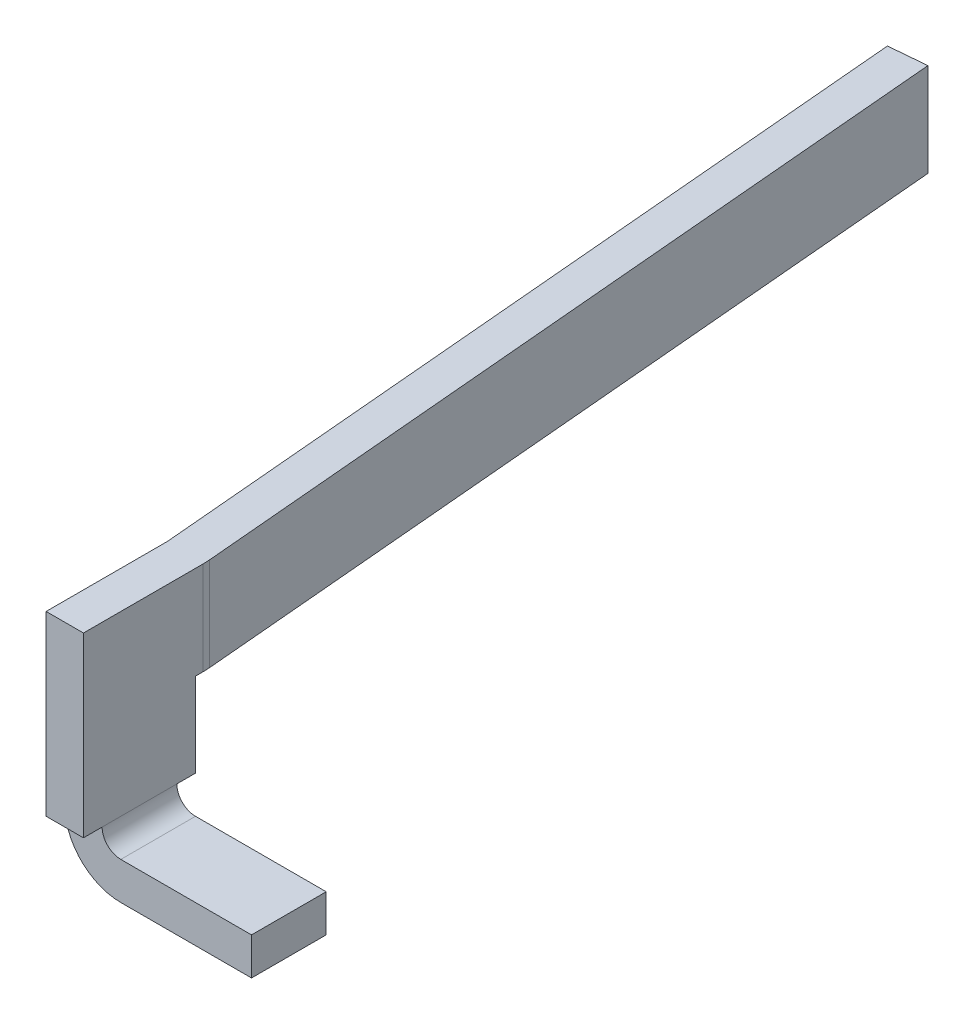
ISO-10303-21;
HEADER;
FILE_DESCRIPTION(('STEP AP214'),'2;1');
FILE_NAME('part.step','',(''),(''),'','','');
FILE_SCHEMA(('AUTOMOTIVE_DESIGN { 1 0 10303 214 1 1 1 1 }'));
ENDSEC;
DATA;
#1=APPLICATION_CONTEXT('core data for automotive mechanical design processes');
#2=APPLICATION_PROTOCOL_DEFINITION('international standard','automotive_design',2000,#1);
#3=PRODUCT_CONTEXT('',#1,'mechanical');
#4=PRODUCT('Part','Part','',(#3));
#5=PRODUCT_RELATED_PRODUCT_CATEGORY('part','',(#4));
#6=PRODUCT_DEFINITION_FORMATION('','',#4);
#7=PRODUCT_DEFINITION_CONTEXT('part definition',#1,'design');
#8=PRODUCT_DEFINITION('design','',#6,#7);
#9=PRODUCT_DEFINITION_SHAPE('','',#8);
#10=(LENGTH_UNIT() NAMED_UNIT(*) SI_UNIT(.MILLI.,.METRE.));
#11=(NAMED_UNIT(*) PLANE_ANGLE_UNIT() SI_UNIT($,.RADIAN.));
#12=(NAMED_UNIT(*) SI_UNIT($,.STERADIAN.) SOLID_ANGLE_UNIT());
#13=UNCERTAINTY_MEASURE_WITH_UNIT(LENGTH_MEASURE(1.E-05),#10,'distance_accuracy_value','');
#14=(GEOMETRIC_REPRESENTATION_CONTEXT(3) GLOBAL_UNCERTAINTY_ASSIGNED_CONTEXT((#13)) GLOBAL_UNIT_ASSIGNED_CONTEXT((#10,
#11,#12)) REPRESENTATION_CONTEXT('',''));
#15=CARTESIAN_POINT('',(0.,0.,0.));
#16=DIRECTION('',(0.,0.,1.));
#17=DIRECTION('',(1.,0.,0.));
#18=AXIS2_PLACEMENT_3D('',#15,#16,#17);
#19=CARTESIAN_POINT('',(5.19934943666418,0.740000000000001,-0.666168161877658));
#20=DIRECTION('',(0.996194698091746,0.,-0.0871557427476471));
#21=DIRECTION('',(-0.0871557427476471,0.,-0.996194698091746));
#22=AXIS2_PLACEMENT_3D('',#19,#20,#21);
#23=PLANE('',#22);
#24=DIRECTION('',(0.,-1.,0.));
#25=VECTOR('',#24,1.);
#26=CARTESIAN_POINT('',(4.8295880933225,1.,-4.89255965581284));
#27=LINE('',#26,#25);
#28=CARTESIAN_POINT('',(4.8295880933225,1.25,-4.89255965581284));
#29=VERTEX_POINT('',#28);
#30=CARTESIAN_POINT('',(4.82958809332251,0.750000000000001,-4.89255965581285));
#31=VERTEX_POINT('',#30);
#32=EDGE_CURVE('E136',#29,#31,#27,.T.);
#33=ORIENTED_EDGE('',*,*,#32,.F.);
#34=DIRECTION('',(-0.0871557427476445,0.,-0.996194698091747));
#35=VECTOR('',#34,1.);
#36=CARTESIAN_POINT('',(5.0140329862796,1.25,-2.78434488233571));
#37=LINE('',#36,#35);
#38=CARTESIAN_POINT('',(5.1984778792367,1.25,-0.676130108858565));
#39=VERTEX_POINT('',#38);
#40=EDGE_CURVE('E133',#39,#29,#37,.T.);
#41=ORIENTED_EDGE('',*,*,#40,.F.);
#42=DIRECTION('',(0.,-1.,0.));
#43=VECTOR('',#42,1.);
#44=CARTESIAN_POINT('',(5.1984778792367,1.,-0.676130108858577));
#45=LINE('',#44,#43);
#46=CARTESIAN_POINT('',(5.1984778792367,0.750000000000002,-0.676130108858565));
#47=VERTEX_POINT('',#46);
#48=EDGE_CURVE('E184',#39,#47,#45,.T.);
#49=ORIENTED_EDGE('',*,*,#48,.T.);
#50=DIRECTION('',(0.0871557427476445,0.,0.996194698091747));
#51=VECTOR('',#50,1.);
#52=CARTESIAN_POINT('',(5.0140329862796,0.750000000000002,-2.78434488233571));
#53=LINE('',#52,#51);
#54=EDGE_CURVE('E151',#31,#47,#53,.T.);
#55=ORIENTED_EDGE('',*,*,#54,.F.);
#56=EDGE_LOOP('',(#33,#41,#49,#55));
#57=FACE_BOUND('',#56,.T.);
#58=ADVANCED_FACE('F17',(#57),#23,.T.);
#59=CARTESIAN_POINT('',(4.62038720672324,0.740000000000001,-4.87425694983583));
#60=DIRECTION('',(-0.087155742747688,0.,-0.996194698091743));
#61=DIRECTION('',(0.,1.,0.));
#62=AXIS2_PLACEMENT_3D('',#59,#60,#61);
#63=PLANE('',#62);
#64=ORIENTED_EDGE('',*,*,#32,.T.);
#65=DIRECTION('',(0.996194698091743,0.,-0.0871557427476917));
#66=VECTOR('',#65,1.);
#67=CARTESIAN_POINT('',(4.72996862351333,0.750000000000001,-4.88384408153808));
#68=LINE('',#67,#66);
#69=CARTESIAN_POINT('',(4.63034915370416,0.750000000000001,-4.87512850726331));
#70=VERTEX_POINT('',#69);
#71=EDGE_CURVE('E142',#70,#31,#68,.T.);
#72=ORIENTED_EDGE('',*,*,#71,.F.);
#73=DIRECTION('',(0.,-1.,0.));
#74=VECTOR('',#73,1.);
#75=CARTESIAN_POINT('',(4.63034915370416,1.,-4.87512850726331));
#76=LINE('',#75,#74);
#77=CARTESIAN_POINT('',(4.63034915370416,1.25,-4.87512850726331));
#78=VERTEX_POINT('',#77);
#79=EDGE_CURVE('E139',#78,#70,#76,.T.);
#80=ORIENTED_EDGE('',*,*,#79,.F.);
#81=DIRECTION('',(0.996194698091743,0.,-0.087155742747688));
#82=VECTOR('',#81,1.);
#83=CARTESIAN_POINT('',(4.72996862351333,1.25,-4.88384408153807));
#84=LINE('',#83,#82);
#85=EDGE_CURVE('E125',#78,#29,#84,.T.);
#86=ORIENTED_EDGE('',*,*,#85,.T.);
#87=EDGE_LOOP('',(#64,#72,#80,#86));
#88=FACE_BOUND('',#87,.T.);
#89=ADVANCED_FACE('F140',(#88),#63,.T.);
#90=CARTESIAN_POINT('',(4.80000000000025,1.25,-0.641267811759518));
#91=DIRECTION('',(0.,-1.,0.));
#92=DIRECTION('',(0.,0.,-1.));
#93=AXIS2_PLACEMENT_3D('',#90,#91,#92);
#94=CYLINDRICAL_SURFACE('',#93,0.39999999999975);
#95=DIRECTION('',(0.,1.,0.));
#96=VECTOR('',#95,1.);
#97=CARTESIAN_POINT('',(5.2,0.775,-0.641267811759518));
#98=LINE('',#97,#96);
#99=CARTESIAN_POINT('',(5.2,0.750000000000002,-0.641267811759518));
#100=VERTEX_POINT('',#99);
#101=CARTESIAN_POINT('',(5.2,1.25,-0.641267811759518));
#102=VERTEX_POINT('',#101);
#103=EDGE_CURVE('E208',#100,#102,#98,.T.);
#104=ORIENTED_EDGE('',*,*,#103,.F.);
#105=CARTESIAN_POINT('',(4.80000000000025,0.750000000000002,-0.641267811759518));
#106=DIRECTION('',(0.,-1.,0.));
#107=DIRECTION('',(0.,0.,-1.));
#108=AXIS2_PLACEMENT_3D('',#105,#106,#107);
#109=CIRCLE('',#108,0.39999999999975);
#110=EDGE_CURVE('E206',#47,#100,#109,.T.);
#111=ORIENTED_EDGE('',*,*,#110,.F.);
#112=ORIENTED_EDGE('',*,*,#48,.F.);
#113=CARTESIAN_POINT('',(4.80000000000025,1.25,-0.641267811759518));
#114=DIRECTION('',(0.,1.,0.));
#115=DIRECTION('',(0.,0.,1.));
#116=AXIS2_PLACEMENT_3D('',#113,#114,#115);
#117=CIRCLE('',#116,0.39999999999975);
#118=EDGE_CURVE('E21',#102,#39,#117,.T.);
#119=ORIENTED_EDGE('',*,*,#118,.F.);
#120=EDGE_LOOP('',(#104,#111,#112,#119));
#121=FACE_BOUND('',#120,.T.);
#122=ADVANCED_FACE('F415',(#121),#94,.T.);
#123=CARTESIAN_POINT('',(4.62947759627668,0.740000000000001,-4.88509045424423));
#124=DIRECTION('',(-0.996194698091746,0.,0.087155742747647));
#125=DIRECTION('',(0.087155742747647,0.,0.996194698091746));
#126=AXIS2_PLACEMENT_3D('',#123,#124,#125);
#127=PLANE('',#126);
#128=ORIENTED_EDGE('',*,*,#79,.T.);
#129=DIRECTION('',(0.0871557427476468,0.,0.996194698091747));
#130=VECTOR('',#129,1.);
#131=CARTESIAN_POINT('',(4.81479404666126,0.750000000000001,-2.76691373378618));
#132=LINE('',#131,#130);
#133=CARTESIAN_POINT('',(4.99923893961835,0.750000000000002,-0.658698960309061));
#134=VERTEX_POINT('',#133);
#135=EDGE_CURVE('E145',#70,#134,#132,.T.);
#136=ORIENTED_EDGE('',*,*,#135,.T.);
#137=DIRECTION('',(0.,-1.,0.));
#138=VECTOR('',#137,1.);
#139=CARTESIAN_POINT('',(4.99923893961835,1.,-0.658698960309047));
#140=LINE('',#139,#138);
#141=CARTESIAN_POINT('',(4.99923893961835,1.25,-0.658698960309061));
#142=VERTEX_POINT('',#141);
#143=EDGE_CURVE('E149',#142,#134,#140,.T.);
#144=ORIENTED_EDGE('',*,*,#143,.F.);
#145=DIRECTION('',(-0.087155742747647,0.,-0.996194698091747));
#146=VECTOR('',#145,1.);
#147=CARTESIAN_POINT('',(4.81479404666125,1.25,-2.76691373378618));
#148=LINE('',#147,#146);
#149=EDGE_CURVE('E130',#142,#78,#148,.T.);
#150=ORIENTED_EDGE('',*,*,#149,.T.);
#151=EDGE_LOOP('',(#128,#136,#144,#150));
#152=FACE_BOUND('',#151,.T.);
#153=ADVANCED_FACE('F147',(#152),#127,.T.);
#154=CARTESIAN_POINT('',(6.01,0.199999999999999,-0.0899999999999973));
#155=DIRECTION('',(0.,1.,0.));
#156=DIRECTION('',(0.,0.,-1.));
#157=AXIS2_PLACEMENT_3D('',#154,#155,#156);
#158=PLANE('',#157);
#159=DIRECTION('',(0.,0.,1.));
#160=VECTOR('',#159,1.);
#161=CARTESIAN_POINT('',(6.,0.200000000000001,-0.300000000000001));
#162=LINE('',#161,#160);
#163=CARTESIAN_POINT('',(6.,0.200000000000001,-0.5));
#164=VERTEX_POINT('',#163);
#165=CARTESIAN_POINT('',(6.,0.2,-0.1));
#166=VERTEX_POINT('',#165);
#167=EDGE_CURVE('E212',#164,#166,#162,.T.);
#168=ORIENTED_EDGE('',*,*,#167,.F.);
#169=DIRECTION('',(1.,0.,0.));
#170=VECTOR('',#169,1.);
#171=CARTESIAN_POINT('',(5.65,0.200000000000001,-0.5));
#172=LINE('',#171,#170);
#173=CARTESIAN_POINT('',(5.3,0.200000000000001,-0.5));
#174=VERTEX_POINT('',#173);
#175=EDGE_CURVE('E287',#174,#164,#172,.T.);
#176=ORIENTED_EDGE('',*,*,#175,.F.);
#177=DIRECTION('',(0.,0.,-1.));
#178=VECTOR('',#177,1.);
#179=CARTESIAN_POINT('',(5.3,0.2,-0.3));
#180=LINE('',#179,#178);
#181=CARTESIAN_POINT('',(5.3,0.2,-0.1));
#182=VERTEX_POINT('',#181);
#183=EDGE_CURVE('E341',#182,#174,#180,.T.);
#184=ORIENTED_EDGE('',*,*,#183,.F.);
#185=DIRECTION('',(-1.,0.,0.));
#186=VECTOR('',#185,1.);
#187=CARTESIAN_POINT('',(5.65,0.2,-0.1));
#188=LINE('',#187,#186);
#189=EDGE_CURVE('E267',#166,#182,#188,.T.);
#190=ORIENTED_EDGE('',*,*,#189,.F.);
#191=EDGE_LOOP('',(#168,#176,#184,#190));
#192=FACE_BOUND('',#191,.T.);
#193=ADVANCED_FACE('F357',(#192),#158,.T.);
#194=CARTESIAN_POINT('',(5.2,0.289999999999999,0.0100000030709557));
#195=DIRECTION('',(1.,0.,0.));
#196=DIRECTION('',(0.,0.,-1.));
#197=AXIS2_PLACEMENT_3D('',#194,#195,#196);
#198=PLANE('',#197);
#199=DIRECTION('',(0.,0.,-1.));
#200=VECTOR('',#199,1.);
#201=CARTESIAN_POINT('',(5.2,1.25,-0.320633904344281));
#202=LINE('',#201,#200);
#203=CARTESIAN_POINT('',(5.2,1.25,3.07095561071902E-09));
#204=VERTEX_POINT('',#203);
#205=EDGE_CURVE('E163',#204,#102,#202,.T.);
#206=ORIENTED_EDGE('',*,*,#205,.F.);
#207=DIRECTION('',(0.,1.,2.72973850988513E-09));
#208=VECTOR('',#207,1.);
#209=CARTESIAN_POINT('',(5.2,0.775,1.77432983301632E-09));
#210=LINE('',#209,#208);
#211=CARTESIAN_POINT('',(5.2,0.299999999999999,4.77704037496E-10));
#212=VERTEX_POINT('',#211);
#213=EDGE_CURVE('E167',#212,#204,#210,.T.);
#214=ORIENTED_EDGE('',*,*,#213,.F.);
#215=DIRECTION('',(0.,0.,1.));
#216=VECTOR('',#215,1.);
#217=CARTESIAN_POINT('',(5.2,0.299999999999999,-0.049999999761148));
#218=LINE('',#217,#216);
#219=CARTESIAN_POINT('',(5.2,0.299999999999999,-0.1));
#220=VERTEX_POINT('',#219);
#221=EDGE_CURVE('E101',#220,#212,#218,.T.);
#222=ORIENTED_EDGE('',*,*,#221,.F.);
#223=DIRECTION('',(0.,0.,1.));
#224=VECTOR('',#223,1.);
#225=CARTESIAN_POINT('',(5.2,0.3,-0.3));
#226=LINE('',#225,#224);
#227=CARTESIAN_POINT('',(5.2,0.300000000000001,-0.5));
#228=VERTEX_POINT('',#227);
#229=EDGE_CURVE('E335',#228,#220,#226,.T.);
#230=ORIENTED_EDGE('',*,*,#229,.F.);
#231=DIRECTION('',(0.,0.,1.));
#232=VECTOR('',#231,1.);
#233=CARTESIAN_POINT('',(5.2,0.300000000000001,-0.550000000170609));
#234=LINE('',#233,#232);
#235=CARTESIAN_POINT('',(5.2,0.300000000000001,-0.600000000341217));
#236=VERTEX_POINT('',#235);
#237=EDGE_CURVE('E257',#236,#228,#234,.T.);
#238=ORIENTED_EDGE('',*,*,#237,.F.);
#239=DIRECTION('',(0.,-1.,0.));
#240=VECTOR('',#239,1.);
#241=CARTESIAN_POINT('',(5.2,0.525000000000002,-0.600000000341217));
#242=LINE('',#241,#240);
#243=CARTESIAN_POINT('',(5.2,0.750000000000002,-0.600000000341217));
#244=VERTEX_POINT('',#243);
#245=EDGE_CURVE('E290',#244,#236,#242,.T.);
#246=ORIENTED_EDGE('',*,*,#245,.F.);
#247=DIRECTION('',(0.,0.,1.));
#248=VECTOR('',#247,1.);
#249=CARTESIAN_POINT('',(5.2,0.750000000000002,-0.620633906050368));
#250=LINE('',#249,#248);
#251=EDGE_CURVE('E204',#100,#244,#250,.T.);
#252=ORIENTED_EDGE('',*,*,#251,.F.);
#253=ORIENTED_EDGE('',*,*,#103,.T.);
#254=EDGE_LOOP('',(#206,#214,#222,#230,#238,#246,#252,#253));
#255=FACE_BOUND('',#254,.T.);
#256=ADVANCED_FACE('F316',(#255),#198,.T.);
#257=CARTESIAN_POINT('',(6.,0.210000000000001,-0.510000000000001));
#258=DIRECTION('',(1.,0.,0.));
#259=DIRECTION('',(0.,0.,1.));
#260=AXIS2_PLACEMENT_3D('',#257,#258,#259);
#261=PLANE('',#260);
#262=DIRECTION('',(0.,0.,1.));
#263=VECTOR('',#262,1.);
#264=CARTESIAN_POINT('',(6.,0.,-0.3));
#265=LINE('',#264,#263);
#266=CARTESIAN_POINT('',(6.,0.,-0.499999999999999));
#267=VERTEX_POINT('',#266);
#268=CARTESIAN_POINT('',(6.,0.,-0.100000000000001));
#269=VERTEX_POINT('',#268);
#270=EDGE_CURVE('E279',#267,#269,#265,.T.);
#271=ORIENTED_EDGE('',*,*,#270,.F.);
#272=DIRECTION('',(0.,-1.,0.));
#273=VECTOR('',#272,1.);
#274=CARTESIAN_POINT('',(6.,0.100000000000001,-0.5));
#275=LINE('',#274,#273);
#276=EDGE_CURVE('E258',#164,#267,#275,.T.);
#277=ORIENTED_EDGE('',*,*,#276,.F.);
#278=ORIENTED_EDGE('',*,*,#167,.T.);
#279=DIRECTION('',(0.,1.,0.));
#280=VECTOR('',#279,1.);
#281=CARTESIAN_POINT('',(6.,0.0999999999999994,-0.100000000000001));
#282=LINE('',#281,#280);
#283=EDGE_CURVE('E272',#269,#166,#282,.T.);
#284=ORIENTED_EDGE('',*,*,#283,.F.);
#285=EDGE_LOOP('',(#271,#277,#278,#284));
#286=FACE_BOUND('',#285,.T.);
#287=ADVANCED_FACE('F367',(#286),#261,.T.);
#288=CARTESIAN_POINT('',(5.21,0.299999999999999,-0.11));
#289=DIRECTION('',(0.,-1.,0.));
#290=DIRECTION('',(0.,0.,1.));
#291=AXIS2_PLACEMENT_3D('',#288,#289,#290);
#292=PLANE('',#291);
#293=DIRECTION('',(1.,0.,0.));
#294=VECTOR('',#293,1.);
#295=CARTESIAN_POINT('',(5.1,0.299999999999999,4.77704040820881E-10));
#296=LINE('',#295,#294);
#297=CARTESIAN_POINT('',(5.,0.299999999999999,4.77703998031046E-10));
#298=VERTEX_POINT('',#297);
#299=EDGE_CURVE('E169',#298,#212,#296,.T.);
#300=ORIENTED_EDGE('',*,*,#299,.F.);
#301=DIRECTION('',(0.,0.,1.));
#302=VECTOR('',#301,1.);
#303=CARTESIAN_POINT('',(5.,0.299999999999999,-0.320633904344281));
#304=LINE('',#303,#302);
#305=CARTESIAN_POINT('',(5.,0.299999999999999,-0.0999999999999999));
#306=VERTEX_POINT('',#305);
#307=EDGE_CURVE('E240',#306,#298,#304,.T.);
#308=ORIENTED_EDGE('',*,*,#307,.F.);
#309=DIRECTION('',(-1.,0.,0.));
#310=VECTOR('',#309,1.);
#311=CARTESIAN_POINT('',(5.15,0.299999999999999,-0.1));
#312=LINE('',#311,#310);
#313=EDGE_CURVE('E200',#220,#306,#312,.T.);
#314=ORIENTED_EDGE('',*,*,#313,.F.);
#315=ORIENTED_EDGE('',*,*,#221,.T.);
#316=EDGE_LOOP('',(#300,#308,#314,#315));
#317=FACE_BOUND('',#316,.T.);
#318=ADVANCED_FACE('F404',(#317),#292,.T.);
#319=CARTESIAN_POINT('',(4.99,1.26,3.09825301031061E-09));
#320=DIRECTION('',(0.,-2.72973850988513E-09,1.));
#321=DIRECTION('',(0.,-1.,-2.72973850988513E-09));
#322=AXIS2_PLACEMENT_3D('',#319,#320,#321);
#323=PLANE('',#322);
#324=DIRECTION('',(1.,0.,0.));
#325=VECTOR('',#324,1.);
#326=CARTESIAN_POINT('',(5.1,1.25,3.07095555683926E-09));
#327=LINE('',#326,#325);
#328=CARTESIAN_POINT('',(5.,1.25,2.42264269449242E-09));
#329=VERTEX_POINT('',#328);
#330=EDGE_CURVE('E166',#329,#204,#327,.T.);
#331=ORIENTED_EDGE('',*,*,#330,.F.);
#332=DIRECTION('',(0.,1.,0.));
#333=VECTOR('',#332,1.);
#334=CARTESIAN_POINT('',(5.,0.775,4.77703976636129E-10));
#335=LINE('',#334,#333);
#336=EDGE_CURVE('E235',#298,#329,#335,.T.);
#337=ORIENTED_EDGE('',*,*,#336,.F.);
#338=ORIENTED_EDGE('',*,*,#299,.T.);
#339=ORIENTED_EDGE('',*,*,#213,.T.);
#340=EDGE_LOOP('',(#331,#337,#338,#339));
#341=FACE_BOUND('',#340,.T.);
#342=ADVANCED_FACE('F401',(#341),#323,.T.);
#343=CARTESIAN_POINT('',(4.99,1.25,-0.651267811759518));
#344=DIRECTION('',(0.,1.,0.));
#345=DIRECTION('',(0.,0.,1.));
#346=AXIS2_PLACEMENT_3D('',#343,#344,#345);
#347=PLANE('',#346);
#348=ORIENTED_EDGE('',*,*,#330,.T.);
#349=ORIENTED_EDGE('',*,*,#205,.T.);
#350=ORIENTED_EDGE('',*,*,#118,.T.);
#351=ORIENTED_EDGE('',*,*,#40,.T.);
#352=ORIENTED_EDGE('',*,*,#85,.F.);
#353=ORIENTED_EDGE('',*,*,#149,.F.);
#354=CARTESIAN_POINT('',(4.79999999999968,1.25,-0.641267811759517));
#355=DIRECTION('',(0.,1.,0.));
#356=DIRECTION('',(0.,0.,1.));
#357=AXIS2_PLACEMENT_3D('',#354,#355,#356);
#358=CIRCLE('',#357,0.200000000000321);
#359=CARTESIAN_POINT('',(5.,1.25,-0.641267811759518));
#360=VERTEX_POINT('',#359);
#361=EDGE_CURVE('E202',#360,#142,#358,.T.);
#362=ORIENTED_EDGE('',*,*,#361,.F.);
#363=DIRECTION('',(0.,0.,-1.));
#364=VECTOR('',#363,1.);
#365=CARTESIAN_POINT('',(5.,1.25,-0.320633904344281));
#366=LINE('',#365,#364);
#367=EDGE_CURVE('E230',#329,#360,#366,.T.);
#368=ORIENTED_EDGE('',*,*,#367,.F.);
#369=EDGE_LOOP('',(#348,#349,#350,#351,#352,#353,#362,#368));
#370=FACE_BOUND('',#369,.T.);
#371=ADVANCED_FACE('F128',(#370),#347,.T.);
#372=CARTESIAN_POINT('',(4.79999999999968,0.750000000000002,-0.641267811759517));
#373=DIRECTION('',(0.,1.,0.));
#374=DIRECTION('',(0.,0.,1.));
#375=AXIS2_PLACEMENT_3D('',#372,#373,#374);
#376=CYLINDRICAL_SURFACE('',#375,0.200000000000321);
#377=DIRECTION('',(0.,-1.,0.));
#378=VECTOR('',#377,1.);
#379=CARTESIAN_POINT('',(5.,0.775,-0.641267811759518));
#380=LINE('',#379,#378);
#381=CARTESIAN_POINT('',(5.,0.750000000000002,-0.641267811759518));
#382=VERTEX_POINT('',#381);
#383=EDGE_CURVE('E227',#360,#382,#380,.T.);
#384=ORIENTED_EDGE('',*,*,#383,.F.);
#385=ORIENTED_EDGE('',*,*,#361,.T.);
#386=ORIENTED_EDGE('',*,*,#143,.T.);
#387=CARTESIAN_POINT('',(4.79999999999968,0.750000000000002,-0.641267811759517));
#388=DIRECTION('',(0.,1.,0.));
#389=DIRECTION('',(0.,0.,1.));
#390=AXIS2_PLACEMENT_3D('',#387,#388,#389);
#391=CIRCLE('',#390,0.200000000000321);
#392=EDGE_CURVE('E205',#134,#382,#391,.F.);
#393=ORIENTED_EDGE('',*,*,#392,.T.);
#394=EDGE_LOOP('',(#384,#385,#386,#393));
#395=FACE_BOUND('',#394,.T.);
#396=ADVANCED_FACE('F226',(#395),#376,.F.);
#397=CARTESIAN_POINT('',(4.99,0.750000000000002,-0.595873219199387));
#398=DIRECTION('',(0.,-1.,0.));
#399=DIRECTION('',(0.,0.,-1.));
#400=AXIS2_PLACEMENT_3D('',#397,#398,#399);
#401=PLANE('',#400);
#402=DIRECTION('',(1.,0.,0.));
#403=VECTOR('',#402,1.);
#404=CARTESIAN_POINT('',(5.1,0.750000000000002,-0.600000000341217));
#405=LINE('',#404,#403);
#406=CARTESIAN_POINT('',(5.,0.750000000000002,-0.600000000341217));
#407=VERTEX_POINT('',#406);
#408=EDGE_CURVE('E293',#407,#244,#405,.T.);
#409=ORIENTED_EDGE('',*,*,#408,.F.);
#410=DIRECTION('',(0.,0.,1.));
#411=VECTOR('',#410,1.);
#412=CARTESIAN_POINT('',(5.,0.750000000000002,-0.320633904344281));
#413=LINE('',#412,#411);
#414=EDGE_CURVE('E222',#382,#407,#413,.T.);
#415=ORIENTED_EDGE('',*,*,#414,.F.);
#416=ORIENTED_EDGE('',*,*,#392,.F.);
#417=ORIENTED_EDGE('',*,*,#135,.F.);
#418=ORIENTED_EDGE('',*,*,#71,.T.);
#419=ORIENTED_EDGE('',*,*,#54,.T.);
#420=ORIENTED_EDGE('',*,*,#110,.T.);
#421=ORIENTED_EDGE('',*,*,#251,.T.);
#422=EDGE_LOOP('',(#409,#415,#416,#417,#418,#419,#420,#421));
#423=FACE_BOUND('',#422,.T.);
#424=ADVANCED_FACE('F218',(#423),#401,.T.);
#425=CARTESIAN_POINT('',(4.99,0.290000000000001,-0.600000000341217));
#426=DIRECTION('',(0.,0.,-1.));
#427=DIRECTION('',(0.,1.,0.));
#428=AXIS2_PLACEMENT_3D('',#425,#426,#427);
#429=PLANE('',#428);
#430=ORIENTED_EDGE('',*,*,#408,.T.);
#431=ORIENTED_EDGE('',*,*,#245,.T.);
#432=DIRECTION('',(1.,0.,0.));
#433=VECTOR('',#432,1.);
#434=CARTESIAN_POINT('',(5.1,0.300000000000001,-0.600000000341217));
#435=LINE('',#434,#433);
#436=CARTESIAN_POINT('',(5.,0.300000000000001,-0.600000000341217));
#437=VERTEX_POINT('',#436);
#438=EDGE_CURVE('E254',#437,#236,#435,.T.);
#439=ORIENTED_EDGE('',*,*,#438,.F.);
#440=DIRECTION('',(0.,-1.,0.));
#441=VECTOR('',#440,1.);
#442=CARTESIAN_POINT('',(5.,0.775,-0.600000000341217));
#443=LINE('',#442,#441);
#444=EDGE_CURVE('E261',#407,#437,#443,.T.);
#445=ORIENTED_EDGE('',*,*,#444,.F.);
#446=EDGE_LOOP('',(#430,#431,#439,#445));
#447=FACE_BOUND('',#446,.T.);
#448=ADVANCED_FACE('F319',(#447),#429,.T.);
#449=CARTESIAN_POINT('',(5.21,0.300000000000001,-0.610000000341217));
#450=DIRECTION('',(0.,-1.,0.));
#451=DIRECTION('',(0.,0.,1.));
#452=AXIS2_PLACEMENT_3D('',#449,#450,#451);
#453=PLANE('',#452);
#454=ORIENTED_EDGE('',*,*,#438,.T.);
#455=ORIENTED_EDGE('',*,*,#237,.T.);
#456=DIRECTION('',(1.,0.,0.));
#457=VECTOR('',#456,1.);
#458=CARTESIAN_POINT('',(5.15,0.300000000000001,-0.5));
#459=LINE('',#458,#457);
#460=CARTESIAN_POINT('',(5.,0.300000000000001,-0.5));
#461=VERTEX_POINT('',#460);
#462=EDGE_CURVE('E36',#461,#228,#459,.T.);
#463=ORIENTED_EDGE('',*,*,#462,.F.);
#464=DIRECTION('',(0.,0.,1.));
#465=VECTOR('',#464,1.);
#466=CARTESIAN_POINT('',(5.,0.300000000000001,-0.320633904344281));
#467=LINE('',#466,#465);
#468=EDGE_CURVE('E244',#437,#461,#467,.T.);
#469=ORIENTED_EDGE('',*,*,#468,.F.);
#470=EDGE_LOOP('',(#454,#455,#463,#469));
#471=FACE_BOUND('',#470,.T.);
#472=ADVANCED_FACE('F321',(#471),#453,.T.);
#473=CARTESIAN_POINT('',(5.3,0.300000000000001,-0.5));
#474=DIRECTION('',(0.,0.,1.));
#475=DIRECTION('',(1.,0.,0.));
#476=AXIS2_PLACEMENT_3D('',#473,#474,#475);
#477=CYLINDRICAL_SURFACE('',#476,0.0999999999999998);
#478=ORIENTED_EDGE('',*,*,#229,.T.);
#479=CARTESIAN_POINT('',(5.3,0.300000000000001,-0.1));
#480=DIRECTION('',(0.,0.,1.));
#481=DIRECTION('',(1.,0.,0.));
#482=AXIS2_PLACEMENT_3D('',#479,#480,#481);
#483=CIRCLE('',#482,0.0999999999999998);
#484=EDGE_CURVE('E197',#182,#220,#483,.F.);
#485=ORIENTED_EDGE('',*,*,#484,.F.);
#486=ORIENTED_EDGE('',*,*,#183,.T.);
#487=CARTESIAN_POINT('',(5.3,0.300000000000001,-0.5));
#488=DIRECTION('',(0.,0.,1.));
#489=DIRECTION('',(1.,0.,0.));
#490=AXIS2_PLACEMENT_3D('',#487,#488,#489);
#491=CIRCLE('',#490,0.0999999999999998);
#492=EDGE_CURVE('E194',#228,#174,#491,.T.);
#493=ORIENTED_EDGE('',*,*,#492,.F.);
#494=EDGE_LOOP('',(#478,#485,#486,#493));
#495=FACE_BOUND('',#494,.T.);
#496=ADVANCED_FACE('F361',(#495),#477,.F.);
#497=CARTESIAN_POINT('',(6.01,0.,-0.510000000000001));
#498=DIRECTION('',(0.,-1.,0.));
#499=DIRECTION('',(0.,0.,1.));
#500=AXIS2_PLACEMENT_3D('',#497,#498,#499);
#501=PLANE('',#500);
#502=ORIENTED_EDGE('',*,*,#270,.T.);
#503=DIRECTION('',(-1.,0.,0.));
#504=VECTOR('',#503,1.);
#505=CARTESIAN_POINT('',(5.65,0.,-0.100000000000002));
#506=LINE('',#505,#504);
#507=CARTESIAN_POINT('',(5.3,0.,-0.100000000000002));
#508=VERTEX_POINT('',#507);
#509=EDGE_CURVE('E201',#269,#508,#506,.T.);
#510=ORIENTED_EDGE('',*,*,#509,.T.);
#511=DIRECTION('',(0.,0.,1.));
#512=VECTOR('',#511,1.);
#513=CARTESIAN_POINT('',(5.3,0.,-0.300000000000001));
#514=LINE('',#513,#512);
#515=CARTESIAN_POINT('',(5.3,0.,-0.500000000000001));
#516=VERTEX_POINT('',#515);
#517=EDGE_CURVE('E193',#516,#508,#514,.T.);
#518=ORIENTED_EDGE('',*,*,#517,.F.);
#519=DIRECTION('',(1.,0.,0.));
#520=VECTOR('',#519,1.);
#521=CARTESIAN_POINT('',(5.65,0.,-0.5));
#522=LINE('',#521,#520);
#523=EDGE_CURVE('E282',#516,#267,#522,.T.);
#524=ORIENTED_EDGE('',*,*,#523,.T.);
#525=EDGE_LOOP('',(#502,#510,#518,#524));
#526=FACE_BOUND('',#525,.T.);
#527=ADVANCED_FACE('F370',(#526),#501,.T.);
#528=CARTESIAN_POINT('',(4.99,-0.0100000000000011,-0.100000000000001));
#529=DIRECTION('',(0.,0.,1.));
#530=DIRECTION('',(1.,0.,0.));
#531=AXIS2_PLACEMENT_3D('',#528,#529,#530);
#532=PLANE('',#531);
#533=ORIENTED_EDGE('',*,*,#313,.T.);
#534=CARTESIAN_POINT('',(5.3,0.299999999999999,-0.0999999999999997));
#535=DIRECTION('',(0.,0.,-1.));
#536=DIRECTION('',(0.,1.,0.));
#537=AXIS2_PLACEMENT_3D('',#534,#535,#536);
#538=CIRCLE('',#537,0.3);
#539=EDGE_CURVE('E190',#508,#306,#538,.T.);
#540=ORIENTED_EDGE('',*,*,#539,.F.);
#541=ORIENTED_EDGE('',*,*,#509,.F.);
#542=ORIENTED_EDGE('',*,*,#283,.T.);
#543=ORIENTED_EDGE('',*,*,#189,.T.);
#544=ORIENTED_EDGE('',*,*,#484,.T.);
#545=EDGE_LOOP('',(#533,#540,#541,#542,#543,#544));
#546=FACE_BOUND('',#545,.T.);
#547=ADVANCED_FACE('F363',(#546),#532,.T.);
#548=CARTESIAN_POINT('',(5.,0.289999999999999,-0.651267811759518));
#549=DIRECTION('',(-1.,0.,0.));
#550=DIRECTION('',(0.,0.,1.));
#551=AXIS2_PLACEMENT_3D('',#548,#549,#550);
#552=PLANE('',#551);
#553=ORIENTED_EDGE('',*,*,#414,.T.);
#554=ORIENTED_EDGE('',*,*,#444,.T.);
#555=ORIENTED_EDGE('',*,*,#468,.T.);
#556=DIRECTION('',(0.,0.,-1.));
#557=VECTOR('',#556,1.);
#558=CARTESIAN_POINT('',(5.,0.3,-0.3));
#559=LINE('',#558,#557);
#560=EDGE_CURVE('E27',#306,#461,#559,.T.);
#561=ORIENTED_EDGE('',*,*,#560,.F.);
#562=ORIENTED_EDGE('',*,*,#307,.T.);
#563=ORIENTED_EDGE('',*,*,#336,.T.);
#564=ORIENTED_EDGE('',*,*,#367,.T.);
#565=ORIENTED_EDGE('',*,*,#383,.T.);
#566=EDGE_LOOP('',(#553,#554,#555,#561,#562,#563,#564,#565));
#567=FACE_BOUND('',#566,.T.);
#568=ADVANCED_FACE('F238',(#567),#552,.T.);
#569=CARTESIAN_POINT('',(5.31,-0.00999999999999934,-0.500000000000001));
#570=DIRECTION('',(0.,0.,-1.));
#571=DIRECTION('',(-1.,0.,0.));
#572=AXIS2_PLACEMENT_3D('',#569,#570,#571);
#573=PLANE('',#572);
#574=ORIENTED_EDGE('',*,*,#462,.T.);
#575=ORIENTED_EDGE('',*,*,#492,.T.);
#576=ORIENTED_EDGE('',*,*,#175,.T.);
#577=ORIENTED_EDGE('',*,*,#276,.T.);
#578=ORIENTED_EDGE('',*,*,#523,.F.);
#579=CARTESIAN_POINT('',(5.3,0.300000000000001,-0.5));
#580=DIRECTION('',(0.,0.,-1.));
#581=DIRECTION('',(0.,1.,0.));
#582=AXIS2_PLACEMENT_3D('',#579,#580,#581);
#583=CIRCLE('',#582,0.3);
#584=EDGE_CURVE('E11',#461,#516,#583,.F.);
#585=ORIENTED_EDGE('',*,*,#584,.F.);
#586=EDGE_LOOP('',(#574,#575,#576,#577,#578,#585));
#587=FACE_BOUND('',#586,.T.);
#588=ADVANCED_FACE('F352',(#587),#573,.T.);
#589=CARTESIAN_POINT('',(5.3,0.299999999999999,-0.0999999999999997));
#590=DIRECTION('',(0.,0.,-1.));
#591=DIRECTION('',(0.,1.,0.));
#592=AXIS2_PLACEMENT_3D('',#589,#590,#591);
#593=CYLINDRICAL_SURFACE('',#592,0.3);
#594=ORIENTED_EDGE('',*,*,#560,.T.);
#595=ORIENTED_EDGE('',*,*,#584,.T.);
#596=ORIENTED_EDGE('',*,*,#517,.T.);
#597=ORIENTED_EDGE('',*,*,#539,.T.);
#598=EDGE_LOOP('',(#594,#595,#596,#597));
#599=FACE_BOUND('',#598,.T.);
#600=ADVANCED_FACE('F19',(#599),#593,.T.);
#601=CLOSED_SHELL('',(#58,#89,#122,#153,#193,#256,#287,#318,#342,#371,#396,#424,#448,#472,#496,
#527,#547,#568,#588,#600));
#602=MANIFOLD_SOLID_BREP('B1',#601);
#603=ADVANCED_BREP_SHAPE_REPRESENTATION('',(#18,#602),#14);
#604=SHAPE_DEFINITION_REPRESENTATION(#9,#603);
ENDSEC;
END-ISO-10303-21;
